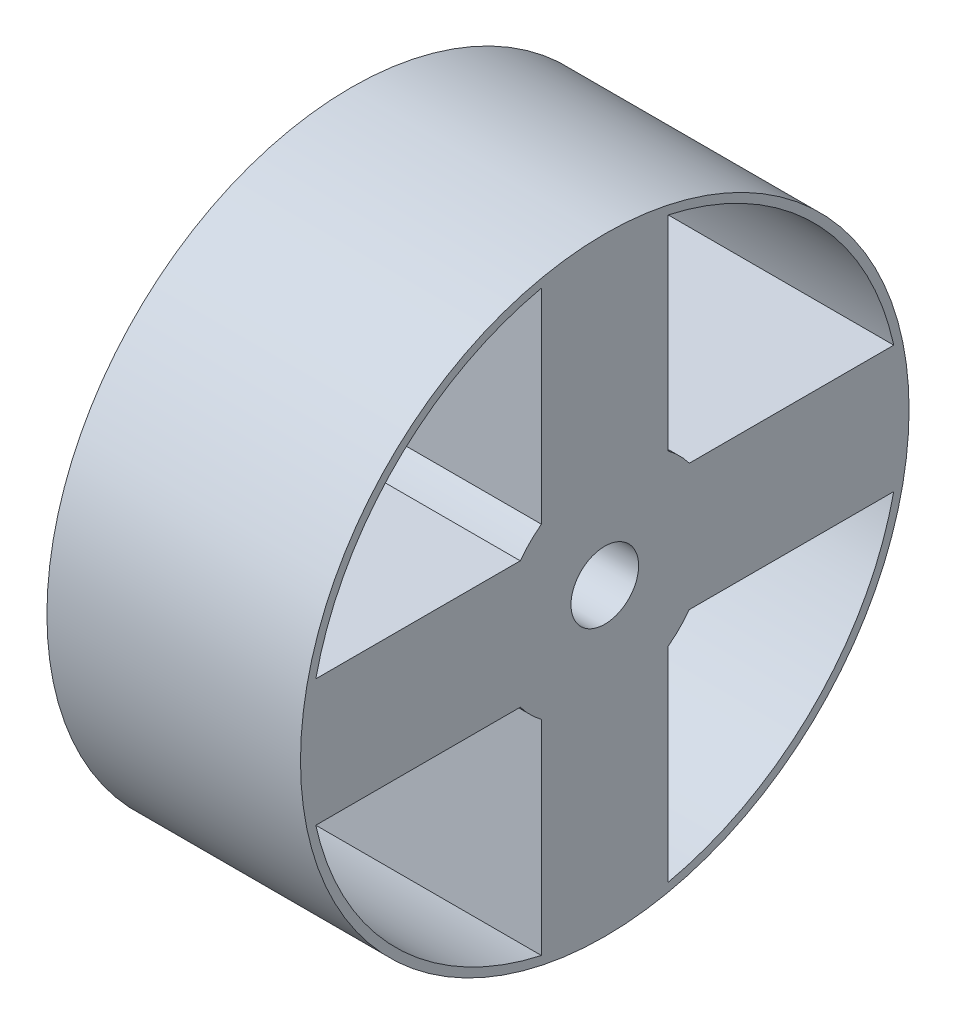
ISO-10303-21;
HEADER;
FILE_DESCRIPTION(('STEP AP214'),'2;1');
FILE_NAME('part.step','',(''),(''),'','','');
FILE_SCHEMA(('AUTOMOTIVE_DESIGN { 1 0 10303 214 1 1 1 1 }'));
ENDSEC;
DATA;
#1=APPLICATION_CONTEXT('core data for automotive mechanical design processes');
#2=APPLICATION_PROTOCOL_DEFINITION('international standard','automotive_design',2000,#1);
#3=PRODUCT_CONTEXT('',#1,'mechanical');
#4=PRODUCT('Part','Part','',(#3));
#5=PRODUCT_RELATED_PRODUCT_CATEGORY('part','',(#4));
#6=PRODUCT_DEFINITION_FORMATION('','',#4);
#7=PRODUCT_DEFINITION_CONTEXT('part definition',#1,'design');
#8=PRODUCT_DEFINITION('design','',#6,#7);
#9=PRODUCT_DEFINITION_SHAPE('','',#8);
#10=(LENGTH_UNIT() NAMED_UNIT(*) SI_UNIT(.MILLI.,.METRE.));
#11=(NAMED_UNIT(*) PLANE_ANGLE_UNIT() SI_UNIT($,.RADIAN.));
#12=(NAMED_UNIT(*) SI_UNIT($,.STERADIAN.) SOLID_ANGLE_UNIT());
#13=UNCERTAINTY_MEASURE_WITH_UNIT(LENGTH_MEASURE(1.E-05),#10,'distance_accuracy_value','');
#14=(GEOMETRIC_REPRESENTATION_CONTEXT(3) GLOBAL_UNCERTAINTY_ASSIGNED_CONTEXT((#13)) GLOBAL_UNIT_ASSIGNED_CONTEXT((#10,
#11,#12)) REPRESENTATION_CONTEXT('',''));
#15=CARTESIAN_POINT('',(0.,0.,0.));
#16=DIRECTION('',(0.,0.,1.));
#17=DIRECTION('',(1.,0.,0.));
#18=AXIS2_PLACEMENT_3D('',#15,#16,#17);
#19=CARTESIAN_POINT('',(76.2,-19.05,86.8349440029761));
#20=DIRECTION('',(0.,1.,0.));
#21=DIRECTION('',(0.,0.,1.));
#22=AXIS2_PLACEMENT_3D('',#19,#20,#21);
#23=PLANE('',#22);
#24=DIRECTION('',(0.,0.,-1.));
#25=VECTOR('',#24,1.);
#26=CARTESIAN_POINT('',(0.,-19.05,86.8349440029761));
#27=LINE('',#26,#25);
#28=CARTESIAN_POINT('',(0.,-19.05,86.8349440029761));
#29=VERTEX_POINT('',#28);
#30=CARTESIAN_POINT('',(0.,-19.05,25.4000000000001));
#31=VERTEX_POINT('',#30);
#32=EDGE_CURVE('E176',#29,#31,#27,.T.);
#33=ORIENTED_EDGE('',*,*,#32,.T.);
#34=DIRECTION('',(-1.,0.,0.));
#35=VECTOR('',#34,1.);
#36=CARTESIAN_POINT('',(76.2,-19.05,25.4000000000001));
#37=LINE('',#36,#35);
#38=CARTESIAN_POINT('',(76.2,-19.05,25.4000000000001));
#39=VERTEX_POINT('',#38);
#40=EDGE_CURVE('E47',#39,#31,#37,.T.);
#41=ORIENTED_EDGE('',*,*,#40,.F.);
#42=DIRECTION('',(0.,0.,-1.));
#43=VECTOR('',#42,1.);
#44=CARTESIAN_POINT('',(76.2,-19.05,86.8349440029761));
#45=LINE('',#44,#43);
#46=CARTESIAN_POINT('',(76.2,-19.05,86.8349440029761));
#47=VERTEX_POINT('',#46);
#48=EDGE_CURVE('E111',#47,#39,#45,.T.);
#49=ORIENTED_EDGE('',*,*,#48,.F.);
#50=DIRECTION('',(-1.,0.,0.));
#51=VECTOR('',#50,1.);
#52=CARTESIAN_POINT('',(76.2,-19.05,86.8349440029761));
#53=LINE('',#52,#51);
#54=EDGE_CURVE('E11',#47,#29,#53,.T.);
#55=ORIENTED_EDGE('',*,*,#54,.T.);
#56=EDGE_LOOP('',(#33,#41,#49,#55));
#57=FACE_BOUND('',#56,.T.);
#58=ADVANCED_FACE('F38',(#57),#23,.F.);
#59=CARTESIAN_POINT('',(76.2,0.,0.));
#60=DIRECTION('',(-1.,0.,0.));
#61=DIRECTION('',(0.,0.,1.));
#62=AXIS2_PLACEMENT_3D('',#59,#60,#61);
#63=CYLINDRICAL_SURFACE('',#62,31.75);
#64=CARTESIAN_POINT('',(0.,0.,0.));
#65=DIRECTION('',(1.,0.,0.));
#66=DIRECTION('',(0.,0.,-1.));
#67=AXIS2_PLACEMENT_3D('',#64,#65,#66);
#68=CIRCLE('',#67,31.75);
#69=CARTESIAN_POINT('',(0.,-25.4,19.0500000000001));
#70=VERTEX_POINT('',#69);
#71=EDGE_CURVE('E178',#31,#70,#68,.T.);
#72=ORIENTED_EDGE('',*,*,#71,.T.);
#73=DIRECTION('',(-1.,0.,0.));
#74=VECTOR('',#73,1.);
#75=CARTESIAN_POINT('',(76.2,-25.4,19.0500000000001));
#76=LINE('',#75,#74);
#77=CARTESIAN_POINT('',(76.2,-25.4,19.0500000000001));
#78=VERTEX_POINT('',#77);
#79=EDGE_CURVE('E228',#78,#70,#76,.T.);
#80=ORIENTED_EDGE('',*,*,#79,.F.);
#81=CARTESIAN_POINT('',(76.2,0.,0.));
#82=DIRECTION('',(1.,0.,0.));
#83=DIRECTION('',(0.,0.,-1.));
#84=AXIS2_PLACEMENT_3D('',#81,#82,#83);
#85=CIRCLE('',#84,31.75);
#86=EDGE_CURVE('E237',#39,#78,#85,.T.);
#87=ORIENTED_EDGE('',*,*,#86,.F.);
#88=ORIENTED_EDGE('',*,*,#40,.T.);
#89=EDGE_LOOP('',(#72,#80,#87,#88));
#90=FACE_BOUND('',#89,.T.);
#91=ADVANCED_FACE('F235',(#90),#63,.T.);
#92=CARTESIAN_POINT('',(76.2,-86.8349440029761,19.05));
#93=DIRECTION('',(0.,0.,-1.));
#94=DIRECTION('',(0.,1.,0.));
#95=AXIS2_PLACEMENT_3D('',#92,#93,#94);
#96=PLANE('',#95);
#97=DIRECTION('',(0.,-1.,0.));
#98=VECTOR('',#97,1.);
#99=CARTESIAN_POINT('',(0.,-86.8349440029761,19.05));
#100=LINE('',#99,#98);
#101=CARTESIAN_POINT('',(0.,-86.8349440029761,19.05));
#102=VERTEX_POINT('',#101);
#103=EDGE_CURVE('E181',#70,#102,#100,.T.);
#104=ORIENTED_EDGE('',*,*,#103,.T.);
#105=DIRECTION('',(-1.,0.,0.));
#106=VECTOR('',#105,1.);
#107=CARTESIAN_POINT('',(76.2,-86.8349440029761,19.05));
#108=LINE('',#107,#106);
#109=CARTESIAN_POINT('',(76.2,-86.8349440029761,19.05));
#110=VERTEX_POINT('',#109);
#111=EDGE_CURVE('E225',#110,#102,#108,.T.);
#112=ORIENTED_EDGE('',*,*,#111,.F.);
#113=DIRECTION('',(0.,-1.,0.));
#114=VECTOR('',#113,1.);
#115=CARTESIAN_POINT('',(76.2,-86.8349440029761,19.05));
#116=LINE('',#115,#114);
#117=EDGE_CURVE('E273',#78,#110,#116,.T.);
#118=ORIENTED_EDGE('',*,*,#117,.F.);
#119=ORIENTED_EDGE('',*,*,#79,.T.);
#120=EDGE_LOOP('',(#104,#112,#118,#119));
#121=FACE_BOUND('',#120,.T.);
#122=ADVANCED_FACE('F249',(#121),#96,.F.);
#123=CARTESIAN_POINT('',(76.2,-86.8349440029761,-19.0499999999999));
#124=DIRECTION('',(0.,0.,1.));
#125=DIRECTION('',(0.,-1.,0.));
#126=AXIS2_PLACEMENT_3D('',#123,#124,#125);
#127=PLANE('',#126);
#128=DIRECTION('',(0.,1.,0.));
#129=VECTOR('',#128,1.);
#130=CARTESIAN_POINT('',(0.,-86.8349440029761,-19.0499999999999));
#131=LINE('',#130,#129);
#132=CARTESIAN_POINT('',(0.,-86.8349440029761,-19.0499999999999));
#133=VERTEX_POINT('',#132);
#134=CARTESIAN_POINT('',(0.,-25.4,-19.0499999999999));
#135=VERTEX_POINT('',#134);
#136=EDGE_CURVE('E183',#133,#135,#131,.T.);
#137=ORIENTED_EDGE('',*,*,#136,.T.);
#138=DIRECTION('',(-1.,0.,0.));
#139=VECTOR('',#138,1.);
#140=CARTESIAN_POINT('',(76.2,-25.4,-19.0499999999999));
#141=LINE('',#140,#139);
#142=CARTESIAN_POINT('',(76.2,-25.4,-19.0499999999999));
#143=VERTEX_POINT('',#142);
#144=EDGE_CURVE('E219',#143,#135,#141,.T.);
#145=ORIENTED_EDGE('',*,*,#144,.F.);
#146=DIRECTION('',(0.,1.,0.));
#147=VECTOR('',#146,1.);
#148=CARTESIAN_POINT('',(76.2,-86.8349440029761,-19.0499999999999));
#149=LINE('',#148,#147);
#150=CARTESIAN_POINT('',(76.2,-86.8349440029761,-19.0499999999999));
#151=VERTEX_POINT('',#150);
#152=EDGE_CURVE('E275',#151,#143,#149,.T.);
#153=ORIENTED_EDGE('',*,*,#152,.F.);
#154=DIRECTION('',(-1.,0.,0.));
#155=VECTOR('',#154,1.);
#156=CARTESIAN_POINT('',(76.2,-86.8349440029761,-19.0499999999999));
#157=LINE('',#156,#155);
#158=EDGE_CURVE('E222',#151,#133,#157,.T.);
#159=ORIENTED_EDGE('',*,*,#158,.T.);
#160=EDGE_LOOP('',(#137,#145,#153,#159));
#161=FACE_BOUND('',#160,.T.);
#162=ADVANCED_FACE('F317',(#161),#127,.F.);
#163=CARTESIAN_POINT('',(76.2,0.,0.));
#164=DIRECTION('',(-1.,0.,0.));
#165=DIRECTION('',(0.,0.,1.));
#166=AXIS2_PLACEMENT_3D('',#163,#164,#165);
#167=CYLINDRICAL_SURFACE('',#166,31.75);
#168=CARTESIAN_POINT('',(0.,0.,0.));
#169=DIRECTION('',(1.,0.,0.));
#170=DIRECTION('',(0.,0.,-1.));
#171=AXIS2_PLACEMENT_3D('',#168,#169,#170);
#172=CIRCLE('',#171,31.75);
#173=CARTESIAN_POINT('',(0.,-19.05,-25.4));
#174=VERTEX_POINT('',#173);
#175=EDGE_CURVE('E185',#135,#174,#172,.T.);
#176=ORIENTED_EDGE('',*,*,#175,.T.);
#177=DIRECTION('',(-1.,0.,0.));
#178=VECTOR('',#177,1.);
#179=CARTESIAN_POINT('',(76.2,-19.05,-25.4));
#180=LINE('',#179,#178);
#181=CARTESIAN_POINT('',(76.2,-19.05,-25.4));
#182=VERTEX_POINT('',#181);
#183=EDGE_CURVE('E216',#182,#174,#180,.T.);
#184=ORIENTED_EDGE('',*,*,#183,.F.);
#185=CARTESIAN_POINT('',(76.2,0.,0.));
#186=DIRECTION('',(1.,0.,0.));
#187=DIRECTION('',(0.,0.,-1.));
#188=AXIS2_PLACEMENT_3D('',#185,#186,#187);
#189=CIRCLE('',#188,31.75);
#190=EDGE_CURVE('E277',#143,#182,#189,.T.);
#191=ORIENTED_EDGE('',*,*,#190,.F.);
#192=ORIENTED_EDGE('',*,*,#144,.T.);
#193=EDGE_LOOP('',(#176,#184,#191,#192));
#194=FACE_BOUND('',#193,.T.);
#195=ADVANCED_FACE('F351',(#194),#167,.T.);
#196=CARTESIAN_POINT('',(76.2,-19.05,-86.8349440029761));
#197=DIRECTION('',(0.,1.,0.));
#198=DIRECTION('',(0.,0.,1.));
#199=AXIS2_PLACEMENT_3D('',#196,#197,#198);
#200=PLANE('',#199);
#201=DIRECTION('',(0.,0.,-1.));
#202=VECTOR('',#201,1.);
#203=CARTESIAN_POINT('',(0.,-19.05,-86.8349440029761));
#204=LINE('',#203,#202);
#205=CARTESIAN_POINT('',(0.,-19.05,-86.8349440029761));
#206=VERTEX_POINT('',#205);
#207=EDGE_CURVE('E187',#174,#206,#204,.T.);
#208=ORIENTED_EDGE('',*,*,#207,.T.);
#209=DIRECTION('',(-1.,0.,0.));
#210=VECTOR('',#209,1.);
#211=CARTESIAN_POINT('',(76.2,-19.05,-86.8349440029761));
#212=LINE('',#211,#210);
#213=CARTESIAN_POINT('',(76.2,-19.05,-86.8349440029761));
#214=VERTEX_POINT('',#213);
#215=EDGE_CURVE('E213',#214,#206,#212,.T.);
#216=ORIENTED_EDGE('',*,*,#215,.F.);
#217=DIRECTION('',(0.,0.,-1.));
#218=VECTOR('',#217,1.);
#219=CARTESIAN_POINT('',(76.2,-19.05,-86.8349440029761));
#220=LINE('',#219,#218);
#221=EDGE_CURVE('E279',#182,#214,#220,.T.);
#222=ORIENTED_EDGE('',*,*,#221,.F.);
#223=ORIENTED_EDGE('',*,*,#183,.T.);
#224=EDGE_LOOP('',(#208,#216,#222,#223));
#225=FACE_BOUND('',#224,.T.);
#226=ADVANCED_FACE('F354',(#225),#200,.F.);
#227=CARTESIAN_POINT('',(76.2,19.05,-86.8349440029761));
#228=DIRECTION('',(0.,-1.,0.));
#229=DIRECTION('',(0.,0.,-1.));
#230=AXIS2_PLACEMENT_3D('',#227,#228,#229);
#231=PLANE('',#230);
#232=DIRECTION('',(0.,0.,1.));
#233=VECTOR('',#232,1.);
#234=CARTESIAN_POINT('',(0.,19.05,-86.8349440029761));
#235=LINE('',#234,#233);
#236=CARTESIAN_POINT('',(0.,19.05,-86.8349440029761));
#237=VERTEX_POINT('',#236);
#238=CARTESIAN_POINT('',(0.,19.05,-25.4));
#239=VERTEX_POINT('',#238);
#240=EDGE_CURVE('E189',#237,#239,#235,.T.);
#241=ORIENTED_EDGE('',*,*,#240,.T.);
#242=DIRECTION('',(-1.,0.,0.));
#243=VECTOR('',#242,1.);
#244=CARTESIAN_POINT('',(76.2,19.05,-25.4));
#245=LINE('',#244,#243);
#246=CARTESIAN_POINT('',(76.2,19.05,-25.4));
#247=VERTEX_POINT('',#246);
#248=EDGE_CURVE('E207',#247,#239,#245,.T.);
#249=ORIENTED_EDGE('',*,*,#248,.F.);
#250=DIRECTION('',(0.,0.,1.));
#251=VECTOR('',#250,1.);
#252=CARTESIAN_POINT('',(76.2,19.05,-86.8349440029761));
#253=LINE('',#252,#251);
#254=CARTESIAN_POINT('',(76.2,19.05,-86.8349440029761));
#255=VERTEX_POINT('',#254);
#256=EDGE_CURVE('E281',#255,#247,#253,.T.);
#257=ORIENTED_EDGE('',*,*,#256,.F.);
#258=DIRECTION('',(-1.,0.,0.));
#259=VECTOR('',#258,1.);
#260=CARTESIAN_POINT('',(76.2,19.05,-86.8349440029761));
#261=LINE('',#260,#259);
#262=EDGE_CURVE('E210',#255,#237,#261,.T.);
#263=ORIENTED_EDGE('',*,*,#262,.T.);
#264=EDGE_LOOP('',(#241,#249,#257,#263));
#265=FACE_BOUND('',#264,.T.);
#266=ADVANCED_FACE('F301',(#265),#231,.F.);
#267=CARTESIAN_POINT('',(76.2,0.,0.));
#268=DIRECTION('',(-1.,0.,0.));
#269=DIRECTION('',(0.,0.,1.));
#270=AXIS2_PLACEMENT_3D('',#267,#268,#269);
#271=CYLINDRICAL_SURFACE('',#270,31.75);
#272=CARTESIAN_POINT('',(0.,0.,0.));
#273=DIRECTION('',(1.,0.,0.));
#274=DIRECTION('',(0.,0.,-1.));
#275=AXIS2_PLACEMENT_3D('',#272,#273,#274);
#276=CIRCLE('',#275,31.75);
#277=CARTESIAN_POINT('',(0.,25.4,-19.05));
#278=VERTEX_POINT('',#277);
#279=EDGE_CURVE('E191',#239,#278,#276,.T.);
#280=ORIENTED_EDGE('',*,*,#279,.T.);
#281=DIRECTION('',(-1.,0.,0.));
#282=VECTOR('',#281,1.);
#283=CARTESIAN_POINT('',(76.2,25.4,-19.05));
#284=LINE('',#283,#282);
#285=CARTESIAN_POINT('',(76.2,25.4,-19.05));
#286=VERTEX_POINT('',#285);
#287=EDGE_CURVE('E204',#286,#278,#284,.T.);
#288=ORIENTED_EDGE('',*,*,#287,.F.);
#289=CARTESIAN_POINT('',(76.2,0.,0.));
#290=DIRECTION('',(1.,0.,0.));
#291=DIRECTION('',(0.,0.,-1.));
#292=AXIS2_PLACEMENT_3D('',#289,#290,#291);
#293=CIRCLE('',#292,31.75);
#294=EDGE_CURVE('E283',#247,#286,#293,.T.);
#295=ORIENTED_EDGE('',*,*,#294,.F.);
#296=ORIENTED_EDGE('',*,*,#248,.T.);
#297=EDGE_LOOP('',(#280,#288,#295,#296));
#298=FACE_BOUND('',#297,.T.);
#299=ADVANCED_FACE('F361',(#298),#271,.T.);
#300=CARTESIAN_POINT('',(76.2,86.8349440029761,-19.05));
#301=DIRECTION('',(0.,0.,1.));
#302=DIRECTION('',(0.,-1.,0.));
#303=AXIS2_PLACEMENT_3D('',#300,#301,#302);
#304=PLANE('',#303);
#305=DIRECTION('',(0.,1.,0.));
#306=VECTOR('',#305,1.);
#307=CARTESIAN_POINT('',(0.,86.8349440029761,-19.05));
#308=LINE('',#307,#306);
#309=CARTESIAN_POINT('',(0.,86.8349440029761,-19.05));
#310=VERTEX_POINT('',#309);
#311=EDGE_CURVE('E193',#278,#310,#308,.T.);
#312=ORIENTED_EDGE('',*,*,#311,.T.);
#313=DIRECTION('',(-1.,0.,0.));
#314=VECTOR('',#313,1.);
#315=CARTESIAN_POINT('',(76.2,86.8349440029761,-19.05));
#316=LINE('',#315,#314);
#317=CARTESIAN_POINT('',(76.2,86.8349440029761,-19.05));
#318=VERTEX_POINT('',#317);
#319=EDGE_CURVE('E201',#318,#310,#316,.T.);
#320=ORIENTED_EDGE('',*,*,#319,.F.);
#321=DIRECTION('',(0.,1.,0.));
#322=VECTOR('',#321,1.);
#323=CARTESIAN_POINT('',(76.2,86.8349440029761,-19.05));
#324=LINE('',#323,#322);
#325=EDGE_CURVE('E161',#286,#318,#324,.T.);
#326=ORIENTED_EDGE('',*,*,#325,.F.);
#327=ORIENTED_EDGE('',*,*,#287,.T.);
#328=EDGE_LOOP('',(#312,#320,#326,#327));
#329=FACE_BOUND('',#328,.T.);
#330=ADVANCED_FACE('F292',(#329),#304,.F.);
#331=CARTESIAN_POINT('',(76.2,86.8349440029761,19.05));
#332=DIRECTION('',(0.,0.,-1.));
#333=DIRECTION('',(0.,1.,0.));
#334=AXIS2_PLACEMENT_3D('',#331,#332,#333);
#335=PLANE('',#334);
#336=DIRECTION('',(0.,-1.,0.));
#337=VECTOR('',#336,1.);
#338=CARTESIAN_POINT('',(0.,86.8349440029761,19.05));
#339=LINE('',#338,#337);
#340=CARTESIAN_POINT('',(0.,86.8349440029761,19.05));
#341=VERTEX_POINT('',#340);
#342=CARTESIAN_POINT('',(0.,25.4,19.05));
#343=VERTEX_POINT('',#342);
#344=EDGE_CURVE('E166',#341,#343,#339,.T.);
#345=ORIENTED_EDGE('',*,*,#344,.T.);
#346=DIRECTION('',(-1.,0.,0.));
#347=VECTOR('',#346,1.);
#348=CARTESIAN_POINT('',(76.2,25.4,19.05));
#349=LINE('',#348,#347);
#350=CARTESIAN_POINT('',(76.2,25.4,19.05));
#351=VERTEX_POINT('',#350);
#352=EDGE_CURVE('E163',#351,#343,#349,.T.);
#353=ORIENTED_EDGE('',*,*,#352,.F.);
#354=DIRECTION('',(0.,-1.,0.));
#355=VECTOR('',#354,1.);
#356=CARTESIAN_POINT('',(76.2,86.8349440029761,19.05));
#357=LINE('',#356,#355);
#358=CARTESIAN_POINT('',(76.2,86.8349440029761,19.05));
#359=VERTEX_POINT('',#358);
#360=EDGE_CURVE('E150',#359,#351,#357,.T.);
#361=ORIENTED_EDGE('',*,*,#360,.F.);
#362=DIRECTION('',(-1.,0.,0.));
#363=VECTOR('',#362,1.);
#364=CARTESIAN_POINT('',(76.2,86.8349440029761,19.05));
#365=LINE('',#364,#363);
#366=EDGE_CURVE('E167',#359,#341,#365,.T.);
#367=ORIENTED_EDGE('',*,*,#366,.T.);
#368=EDGE_LOOP('',(#345,#353,#361,#367));
#369=FACE_BOUND('',#368,.T.);
#370=ADVANCED_FACE('F164',(#369),#335,.F.);
#371=CARTESIAN_POINT('',(76.2,0.,0.));
#372=DIRECTION('',(-1.,0.,0.));
#373=DIRECTION('',(0.,0.,1.));
#374=AXIS2_PLACEMENT_3D('',#371,#372,#373);
#375=CYLINDRICAL_SURFACE('',#374,31.75);
#376=CARTESIAN_POINT('',(0.,0.,0.));
#377=DIRECTION('',(1.,0.,0.));
#378=DIRECTION('',(0.,0.,-1.));
#379=AXIS2_PLACEMENT_3D('',#376,#377,#378);
#380=CIRCLE('',#379,31.75);
#381=CARTESIAN_POINT('',(0.,19.05,25.4));
#382=VERTEX_POINT('',#381);
#383=EDGE_CURVE('E97',#343,#382,#380,.T.);
#384=ORIENTED_EDGE('',*,*,#383,.T.);
#385=DIRECTION('',(-1.,0.,0.));
#386=VECTOR('',#385,1.);
#387=CARTESIAN_POINT('',(76.2,19.05,25.4));
#388=LINE('',#387,#386);
#389=CARTESIAN_POINT('',(76.2,19.05,25.4));
#390=VERTEX_POINT('',#389);
#391=EDGE_CURVE('E168',#390,#382,#388,.T.);
#392=ORIENTED_EDGE('',*,*,#391,.F.);
#393=CARTESIAN_POINT('',(76.2,0.,0.));
#394=DIRECTION('',(1.,0.,0.));
#395=DIRECTION('',(0.,0.,-1.));
#396=AXIS2_PLACEMENT_3D('',#393,#394,#395);
#397=CIRCLE('',#396,31.75);
#398=EDGE_CURVE('E155',#351,#390,#397,.T.);
#399=ORIENTED_EDGE('',*,*,#398,.F.);
#400=ORIENTED_EDGE('',*,*,#352,.T.);
#401=EDGE_LOOP('',(#384,#392,#399,#400));
#402=FACE_BOUND('',#401,.T.);
#403=ADVANCED_FACE('F170',(#402),#375,.T.);
#404=CARTESIAN_POINT('',(76.2,19.05,86.8349440029761));
#405=DIRECTION('',(0.,-1.,0.));
#406=DIRECTION('',(0.,0.,-1.));
#407=AXIS2_PLACEMENT_3D('',#404,#405,#406);
#408=PLANE('',#407);
#409=DIRECTION('',(0.,0.,1.));
#410=VECTOR('',#409,1.);
#411=CARTESIAN_POINT('',(0.,19.05,86.8349440029761));
#412=LINE('',#411,#410);
#413=CARTESIAN_POINT('',(0.,19.05,86.8349440029761));
#414=VERTEX_POINT('',#413);
#415=EDGE_CURVE('E103',#382,#414,#412,.T.);
#416=ORIENTED_EDGE('',*,*,#415,.T.);
#417=DIRECTION('',(-1.,0.,0.));
#418=VECTOR('',#417,1.);
#419=CARTESIAN_POINT('',(76.2,19.05,86.8349440029761));
#420=LINE('',#419,#418);
#421=CARTESIAN_POINT('',(76.2,19.05,86.8349440029761));
#422=VERTEX_POINT('',#421);
#423=EDGE_CURVE('E172',#422,#414,#420,.T.);
#424=ORIENTED_EDGE('',*,*,#423,.F.);
#425=DIRECTION('',(0.,0.,1.));
#426=VECTOR('',#425,1.);
#427=CARTESIAN_POINT('',(76.2,19.05,86.8349440029761));
#428=LINE('',#427,#426);
#429=EDGE_CURVE('E55',#390,#422,#428,.T.);
#430=ORIENTED_EDGE('',*,*,#429,.F.);
#431=ORIENTED_EDGE('',*,*,#391,.T.);
#432=EDGE_LOOP('',(#416,#424,#430,#431));
#433=FACE_BOUND('',#432,.T.);
#434=ADVANCED_FACE('F328',(#433),#408,.F.);
#435=CARTESIAN_POINT('',(76.2,0.,0.));
#436=DIRECTION('',(1.,0.,0.));
#437=DIRECTION('',(0.,0.,-1.));
#438=AXIS2_PLACEMENT_3D('',#435,#436,#437);
#439=PLANE('',#438);
#440=CARTESIAN_POINT('',(76.2,0.,0.));
#441=DIRECTION('',(1.,0.,0.));
#442=DIRECTION('',(0.,0.,-1.));
#443=AXIS2_PLACEMENT_3D('',#440,#441,#442);
#444=CIRCLE('',#443,10.16);
#445=CARTESIAN_POINT('',(76.2,0.,-10.16));
#446=VERTEX_POINT('',#445);
#447=EDGE_CURVE('E505',#446,#446,#444,.T.);
#448=ORIENTED_EDGE('',*,*,#447,.F.);
#449=EDGE_LOOP('',(#448));
#450=FACE_BOUND('',#449,.T.);
#451=CARTESIAN_POINT('',(76.2,0.,0.));
#452=DIRECTION('',(1.,0.,0.));
#453=DIRECTION('',(0.,0.,-1.));
#454=AXIS2_PLACEMENT_3D('',#451,#452,#453);
#455=CIRCLE('',#454,88.9);
#456=EDGE_CURVE('E157',#359,#422,#455,.T.);
#457=ORIENTED_EDGE('',*,*,#456,.F.);
#458=ORIENTED_EDGE('',*,*,#360,.T.);
#459=ORIENTED_EDGE('',*,*,#398,.T.);
#460=ORIENTED_EDGE('',*,*,#429,.T.);
#461=EDGE_LOOP('',(#457,#458,#459,#460));
#462=FACE_BOUND('',#461,.T.);
#463=EDGE_CURVE('E255',#47,#110,#455,.T.);
#464=ORIENTED_EDGE('',*,*,#463,.F.);
#465=ORIENTED_EDGE('',*,*,#48,.T.);
#466=ORIENTED_EDGE('',*,*,#86,.T.);
#467=ORIENTED_EDGE('',*,*,#117,.T.);
#468=EDGE_LOOP('',(#464,#465,#466,#467));
#469=FACE_BOUND('',#468,.T.);
#470=EDGE_CURVE('E256',#151,#214,#455,.T.);
#471=ORIENTED_EDGE('',*,*,#470,.F.);
#472=ORIENTED_EDGE('',*,*,#152,.T.);
#473=ORIENTED_EDGE('',*,*,#190,.T.);
#474=ORIENTED_EDGE('',*,*,#221,.T.);
#475=EDGE_LOOP('',(#471,#472,#473,#474));
#476=FACE_BOUND('',#475,.T.);
#477=ORIENTED_EDGE('',*,*,#325,.T.);
#478=EDGE_CURVE('E258',#255,#318,#455,.T.);
#479=ORIENTED_EDGE('',*,*,#478,.F.);
#480=ORIENTED_EDGE('',*,*,#256,.T.);
#481=ORIENTED_EDGE('',*,*,#294,.T.);
#482=EDGE_LOOP('',(#477,#479,#480,#481));
#483=FACE_BOUND('',#482,.T.);
#484=CARTESIAN_POINT('',(76.2,0.,0.));
#485=DIRECTION('',(1.,0.,0.));
#486=DIRECTION('',(0.,0.,-1.));
#487=AXIS2_PLACEMENT_3D('',#484,#485,#486);
#488=CIRCLE('',#487,91.44);
#489=CARTESIAN_POINT('',(76.2,0.,-91.44));
#490=VERTEX_POINT('',#489);
#491=EDGE_CURVE('E268',#490,#490,#488,.T.);
#492=ORIENTED_EDGE('',*,*,#491,.T.);
#493=EDGE_LOOP('',(#492));
#494=FACE_BOUND('',#493,.T.);
#495=ADVANCED_FACE('F152',(#450,#462,#469,#476,#483,#494),#439,.T.);
#496=CARTESIAN_POINT('',(0.,0.,0.));
#497=DIRECTION('',(1.,0.,0.));
#498=DIRECTION('',(0.,0.,-1.));
#499=AXIS2_PLACEMENT_3D('',#496,#497,#498);
#500=PLANE('',#499);
#501=CARTESIAN_POINT('',(0.,0.,0.));
#502=DIRECTION('',(1.,0.,0.));
#503=DIRECTION('',(0.,0.,-1.));
#504=AXIS2_PLACEMENT_3D('',#501,#502,#503);
#505=CIRCLE('',#504,10.16);
#506=CARTESIAN_POINT('',(0.,0.,-10.16));
#507=VERTEX_POINT('',#506);
#508=EDGE_CURVE('E41',#507,#507,#505,.T.);
#509=ORIENTED_EDGE('',*,*,#508,.T.);
#510=EDGE_LOOP('',(#509));
#511=FACE_BOUND('',#510,.T.);
#512=ORIENTED_EDGE('',*,*,#344,.F.);
#513=CARTESIAN_POINT('',(0.,0.,0.));
#514=DIRECTION('',(1.,0.,0.));
#515=DIRECTION('',(0.,0.,-1.));
#516=AXIS2_PLACEMENT_3D('',#513,#514,#515);
#517=CIRCLE('',#516,88.9);
#518=EDGE_CURVE('E322',#341,#414,#517,.T.);
#519=ORIENTED_EDGE('',*,*,#518,.T.);
#520=ORIENTED_EDGE('',*,*,#415,.F.);
#521=ORIENTED_EDGE('',*,*,#383,.F.);
#522=EDGE_LOOP('',(#512,#519,#520,#521));
#523=FACE_BOUND('',#522,.T.);
#524=ORIENTED_EDGE('',*,*,#32,.F.);
#525=EDGE_CURVE('E246',#29,#102,#517,.T.);
#526=ORIENTED_EDGE('',*,*,#525,.T.);
#527=ORIENTED_EDGE('',*,*,#103,.F.);
#528=ORIENTED_EDGE('',*,*,#71,.F.);
#529=EDGE_LOOP('',(#524,#526,#527,#528));
#530=FACE_BOUND('',#529,.T.);
#531=ORIENTED_EDGE('',*,*,#136,.F.);
#532=EDGE_CURVE('E263',#133,#206,#517,.T.);
#533=ORIENTED_EDGE('',*,*,#532,.T.);
#534=ORIENTED_EDGE('',*,*,#207,.F.);
#535=ORIENTED_EDGE('',*,*,#175,.F.);
#536=EDGE_LOOP('',(#531,#533,#534,#535));
#537=FACE_BOUND('',#536,.T.);
#538=EDGE_CURVE('E264',#237,#310,#517,.T.);
#539=ORIENTED_EDGE('',*,*,#538,.T.);
#540=ORIENTED_EDGE('',*,*,#311,.F.);
#541=ORIENTED_EDGE('',*,*,#279,.F.);
#542=ORIENTED_EDGE('',*,*,#240,.F.);
#543=EDGE_LOOP('',(#539,#540,#541,#542));
#544=FACE_BOUND('',#543,.T.);
#545=CARTESIAN_POINT('',(0.,0.,0.));
#546=DIRECTION('',(1.,0.,0.));
#547=DIRECTION('',(0.,0.,-1.));
#548=AXIS2_PLACEMENT_3D('',#545,#546,#547);
#549=CIRCLE('',#548,91.44);
#550=CARTESIAN_POINT('',(0.,0.,-91.44));
#551=VERTEX_POINT('',#550);
#552=EDGE_CURVE('E179',#551,#551,#549,.T.);
#553=ORIENTED_EDGE('',*,*,#552,.F.);
#554=EDGE_LOOP('',(#553));
#555=FACE_BOUND('',#554,.T.);
#556=ADVANCED_FACE('F241',(#511,#523,#530,#537,#544,#555),#500,.F.);
#557=CARTESIAN_POINT('',(0.,0.,0.));
#558=DIRECTION('',(1.,0.,0.));
#559=DIRECTION('',(0.,0.,-1.));
#560=AXIS2_PLACEMENT_3D('',#557,#558,#559);
#561=CYLINDRICAL_SURFACE('',#560,88.9);
#562=ORIENTED_EDGE('',*,*,#525,.F.);
#563=ORIENTED_EDGE('',*,*,#54,.F.);
#564=ORIENTED_EDGE('',*,*,#463,.T.);
#565=ORIENTED_EDGE('',*,*,#111,.T.);
#566=EDGE_LOOP('',(#562,#563,#564,#565));
#567=FACE_BOUND('',#566,.T.);
#568=ADVANCED_FACE('F253',(#567),#561,.F.);
#569=ORIENTED_EDGE('',*,*,#532,.F.);
#570=ORIENTED_EDGE('',*,*,#158,.F.);
#571=ORIENTED_EDGE('',*,*,#470,.T.);
#572=ORIENTED_EDGE('',*,*,#215,.T.);
#573=EDGE_LOOP('',(#569,#570,#571,#572));
#574=FACE_BOUND('',#573,.T.);
#575=ADVANCED_FACE('F320',(#574),#561,.F.);
#576=ORIENTED_EDGE('',*,*,#538,.F.);
#577=ORIENTED_EDGE('',*,*,#262,.F.);
#578=ORIENTED_EDGE('',*,*,#478,.T.);
#579=ORIENTED_EDGE('',*,*,#319,.T.);
#580=EDGE_LOOP('',(#576,#577,#578,#579));
#581=FACE_BOUND('',#580,.T.);
#582=ADVANCED_FACE('F298',(#581),#561,.F.);
#583=ORIENTED_EDGE('',*,*,#518,.F.);
#584=ORIENTED_EDGE('',*,*,#366,.F.);
#585=ORIENTED_EDGE('',*,*,#456,.T.);
#586=ORIENTED_EDGE('',*,*,#423,.T.);
#587=EDGE_LOOP('',(#583,#584,#585,#586));
#588=FACE_BOUND('',#587,.T.);
#589=ADVANCED_FACE('F327',(#588),#561,.F.);
#590=CARTESIAN_POINT('',(0.,0.,0.));
#591=DIRECTION('',(1.,0.,0.));
#592=DIRECTION('',(0.,0.,-1.));
#593=AXIS2_PLACEMENT_3D('',#590,#591,#592);
#594=CYLINDRICAL_SURFACE('',#593,91.44);
#595=CARTESIAN_POINT('',(0.,0.,-91.44));
#596=CARTESIAN_POINT('',(0.79375,0.,-91.44));
#597=CARTESIAN_POINT('',(1.5875,0.,-91.44));
#598=CARTESIAN_POINT('',(3.175,0.,-91.44));
#599=CARTESIAN_POINT('',(3.96875,0.,-91.44));
#600=CARTESIAN_POINT('',(5.55625,0.,-91.44));
#601=CARTESIAN_POINT('',(6.35,0.,-91.44));
#602=CARTESIAN_POINT('',(7.9375,0.,-91.44));
#603=CARTESIAN_POINT('',(8.73125,0.,-91.44));
#604=CARTESIAN_POINT('',(10.31875,0.,-91.44));
#605=CARTESIAN_POINT('',(11.1125,0.,-91.44));
#606=CARTESIAN_POINT('',(12.7,0.,-91.44));
#607=CARTESIAN_POINT('',(13.49375,0.,-91.44));
#608=CARTESIAN_POINT('',(15.08125,0.,-91.44));
#609=CARTESIAN_POINT('',(15.875,0.,-91.44));
#610=CARTESIAN_POINT('',(17.4625,0.,-91.44));
#611=CARTESIAN_POINT('',(18.25625,0.,-91.44));
#612=CARTESIAN_POINT('',(19.84375,0.,-91.44));
#613=CARTESIAN_POINT('',(20.6375,0.,-91.44));
#614=CARTESIAN_POINT('',(22.225,0.,-91.44));
#615=CARTESIAN_POINT('',(23.01875,0.,-91.44));
#616=CARTESIAN_POINT('',(24.60625,0.,-91.44));
#617=CARTESIAN_POINT('',(25.4,0.,-91.44));
#618=CARTESIAN_POINT('',(26.9875,0.,-91.44));
#619=CARTESIAN_POINT('',(27.78125,0.,-91.44));
#620=CARTESIAN_POINT('',(29.36875,0.,-91.44));
#621=CARTESIAN_POINT('',(30.1625,0.,-91.44));
#622=CARTESIAN_POINT('',(31.75,0.,-91.44));
#623=CARTESIAN_POINT('',(32.54375,0.,-91.44));
#624=CARTESIAN_POINT('',(34.13125,0.,-91.44));
#625=CARTESIAN_POINT('',(34.925,0.,-91.44));
#626=CARTESIAN_POINT('',(36.5125,0.,-91.44));
#627=CARTESIAN_POINT('',(37.30625,0.,-91.44));
#628=CARTESIAN_POINT('',(38.89375,0.,-91.44));
#629=CARTESIAN_POINT('',(39.6875,0.,-91.44));
#630=CARTESIAN_POINT('',(41.275,0.,-91.44));
#631=CARTESIAN_POINT('',(42.06875,0.,-91.44));
#632=CARTESIAN_POINT('',(43.65625,0.,-91.44));
#633=CARTESIAN_POINT('',(44.45,0.,-91.44));
#634=CARTESIAN_POINT('',(46.0375,0.,-91.44));
#635=CARTESIAN_POINT('',(46.83125,0.,-91.44));
#636=CARTESIAN_POINT('',(48.41875,0.,-91.44));
#637=CARTESIAN_POINT('',(49.2125,0.,-91.44));
#638=CARTESIAN_POINT('',(50.8,0.,-91.44));
#639=CARTESIAN_POINT('',(51.59375,0.,-91.44));
#640=CARTESIAN_POINT('',(53.18125,0.,-91.44));
#641=CARTESIAN_POINT('',(53.975,0.,-91.44));
#642=CARTESIAN_POINT('',(55.5625,0.,-91.44));
#643=CARTESIAN_POINT('',(56.35625,0.,-91.44));
#644=CARTESIAN_POINT('',(57.94375,0.,-91.44));
#645=CARTESIAN_POINT('',(58.7375,0.,-91.44));
#646=CARTESIAN_POINT('',(60.325,0.,-91.44));
#647=CARTESIAN_POINT('',(61.11875,0.,-91.44));
#648=CARTESIAN_POINT('',(62.70625,0.,-91.44));
#649=CARTESIAN_POINT('',(63.5,0.,-91.44));
#650=CARTESIAN_POINT('',(65.0875,0.,-91.44));
#651=CARTESIAN_POINT('',(65.88125,0.,-91.44));
#652=CARTESIAN_POINT('',(67.46875,0.,-91.44));
#653=CARTESIAN_POINT('',(68.2625,0.,-91.44));
#654=CARTESIAN_POINT('',(69.85,0.,-91.44));
#655=CARTESIAN_POINT('',(70.64375,0.,-91.44));
#656=CARTESIAN_POINT('',(72.23125,0.,-91.44));
#657=CARTESIAN_POINT('',(73.025,0.,-91.44));
#658=CARTESIAN_POINT('',(74.6125,0.,-91.44));
#659=CARTESIAN_POINT('',(75.40625,0.,-91.44));
#660=CARTESIAN_POINT('',(76.2,0.,-91.44));
#661=B_SPLINE_CURVE_WITH_KNOTS('',3,(#595,#596,#597,#598,#599,#600,#601,#602,#603,#604,#605,
#606,#607,#608,#609,#610,#611,#612,#613,#614,#615,#616,#617,#618,#619,#620,#621,#622,#623,#624,
#625,#626,#627,#628,#629,#630,#631,#632,#633,#634,#635,#636,#637,#638,#639,#640,#641,#642,#643,
#644,#645,#646,#647,#648,#649,#650,#651,#652,#653,#654,#655,#656,#657,#658,#659,#660),
.UNSPECIFIED.,.F.,.F.,(4,2,2,2,2,2,2,2,2,2,2,2,2,2,2,2,2,2,2,2,2,2,2,2,2,2,2,2,2,2,2,2,4),(0.,
2.38125,4.7625,7.14375,9.525,11.90625,14.2875,16.66875,19.05,21.43125,23.8125,26.19375,28.575,
30.95625,33.3375,35.71875,38.1,40.48125,42.8625,45.24375,47.625,50.00625,52.3875,54.76875,57.15,
59.53125,61.9125,64.29375,66.675,69.05625,71.4375,73.81875,76.2),.UNSPECIFIED.);
#662=EDGE_CURVE('BSEAM475',#551,#490,#661,.T.);
#663=ORIENTED_EDGE('',*,*,#552,.T.);
#664=ORIENTED_EDGE('',*,*,#491,.F.);
#665=ORIENTED_EDGE('',*,*,#662,.T.);
#666=ORIENTED_EDGE('',*,*,#662,.F.);
#667=EDGE_LOOP('',(#663,#665,#664,#666));
#668=FACE_BOUND('',#667,.T.);
#669=ADVANCED_FACE('F475',(#668),#594,.T.);
#670=CARTESIAN_POINT('',(-12.7,0.,0.));
#671=DIRECTION('',(1.,0.,0.));
#672=DIRECTION('',(0.,0.,-1.));
#673=AXIS2_PLACEMENT_3D('',#670,#671,#672);
#674=CYLINDRICAL_SURFACE('',#673,10.16);
#675=ORIENTED_EDGE('',*,*,#447,.T.);
#676=EDGE_LOOP('',(#675));
#677=FACE_BOUND('',#676,.T.);
#678=ORIENTED_EDGE('',*,*,#508,.F.);
#679=EDGE_LOOP('',(#678));
#680=FACE_BOUND('',#679,.T.);
#681=ADVANCED_FACE('F482',(#677,#680),#674,.F.);
#682=CLOSED_SHELL('',(#58,#91,#122,#162,#195,#226,#266,#299,#330,#370,#403,#434,#495,#556,#568,
#575,#582,#589,#669,#681));
#683=MANIFOLD_SOLID_BREP('B2',#682);
#684=ADVANCED_BREP_SHAPE_REPRESENTATION('',(#18,#683),#14);
#685=SHAPE_DEFINITION_REPRESENTATION(#9,#684);
ENDSEC;
END-ISO-10303-21;
